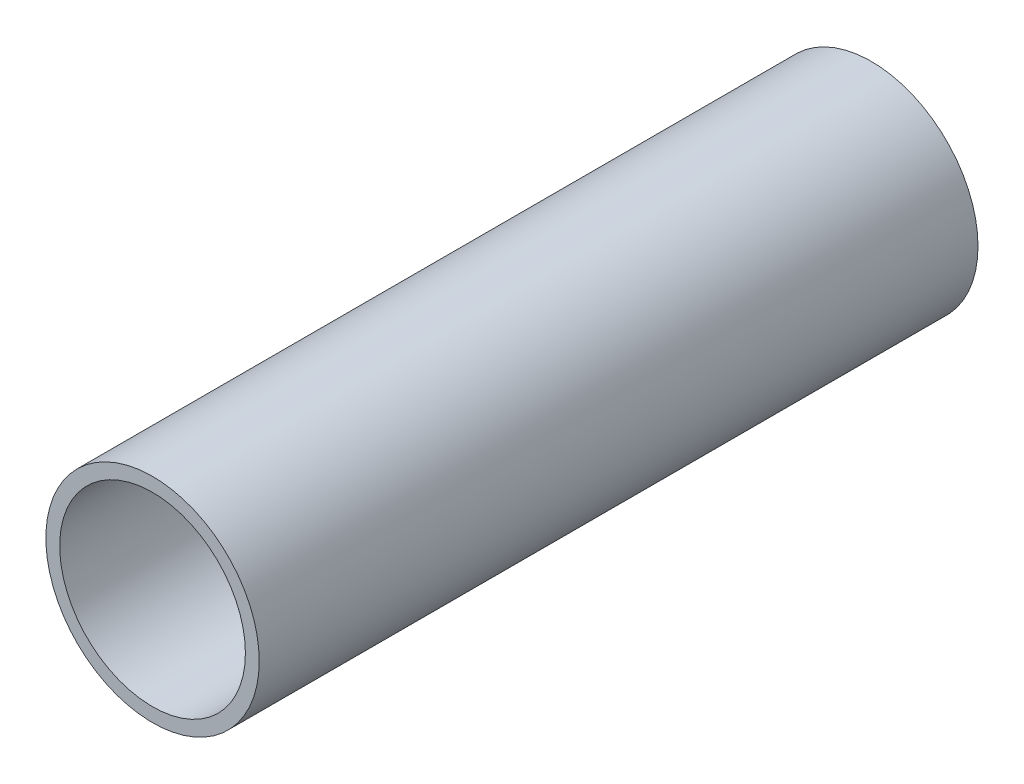
ISO-10303-21;
HEADER;
FILE_DESCRIPTION(('STEP AP214'),'2;1');
FILE_NAME('part.step','',(''),(''),'','','');
FILE_SCHEMA(('AUTOMOTIVE_DESIGN { 1 0 10303 214 1 1 1 1 }'));
ENDSEC;
DATA;
#1=APPLICATION_CONTEXT('core data for automotive mechanical design processes');
#2=APPLICATION_PROTOCOL_DEFINITION('international standard','automotive_design',2000,#1);
#3=PRODUCT_CONTEXT('',#1,'mechanical');
#4=PRODUCT('Part','Part','',(#3));
#5=PRODUCT_RELATED_PRODUCT_CATEGORY('part','',(#4));
#6=PRODUCT_DEFINITION_FORMATION('','',#4);
#7=PRODUCT_DEFINITION_CONTEXT('part definition',#1,'design');
#8=PRODUCT_DEFINITION('design','',#6,#7);
#9=PRODUCT_DEFINITION_SHAPE('','',#8);
#10=(LENGTH_UNIT() NAMED_UNIT(*) SI_UNIT(.MILLI.,.METRE.));
#11=(NAMED_UNIT(*) PLANE_ANGLE_UNIT() SI_UNIT($,.RADIAN.));
#12=(NAMED_UNIT(*) SI_UNIT($,.STERADIAN.) SOLID_ANGLE_UNIT());
#13=UNCERTAINTY_MEASURE_WITH_UNIT(LENGTH_MEASURE(1.E-05),#10,'distance_accuracy_value','');
#14=(GEOMETRIC_REPRESENTATION_CONTEXT(3) GLOBAL_UNCERTAINTY_ASSIGNED_CONTEXT((#13)) GLOBAL_UNIT_ASSIGNED_CONTEXT((#10,
#11,#12)) REPRESENTATION_CONTEXT('',''));
#15=CARTESIAN_POINT('',(0.,0.,0.));
#16=DIRECTION('',(0.,0.,1.));
#17=DIRECTION('',(1.,0.,0.));
#18=AXIS2_PLACEMENT_3D('',#15,#16,#17);
#19=CARTESIAN_POINT('',(0.,0.,203.2));
#20=DIRECTION('',(0.,0.,1.));
#21=DIRECTION('',(1.,0.,0.));
#22=AXIS2_PLACEMENT_3D('',#19,#20,#21);
#23=PLANE('',#22);
#24=CARTESIAN_POINT('',(0.,0.,203.2));
#25=DIRECTION('',(0.,0.,1.));
#26=DIRECTION('',(1.,0.,0.));
#27=AXIS2_PLACEMENT_3D('',#24,#25,#26);
#28=CIRCLE('',#27,30.1625);
#29=CARTESIAN_POINT('',(30.1625,0.,203.2));
#30=VERTEX_POINT('',#29);
#31=EDGE_CURVE('E10',#30,#30,#28,.T.);
#32=ORIENTED_EDGE('',*,*,#31,.T.);
#33=EDGE_LOOP('',(#32));
#34=FACE_BOUND('',#33,.T.);
#35=CARTESIAN_POINT('',(0.,0.,203.2));
#36=DIRECTION('',(0.,0.,1.));
#37=DIRECTION('',(1.,0.,0.));
#38=AXIS2_PLACEMENT_3D('',#35,#36,#37);
#39=CIRCLE('',#38,26.2509);
#40=CARTESIAN_POINT('',(26.2509,0.,203.2));
#41=VERTEX_POINT('',#40);
#42=EDGE_CURVE('E54',#41,#41,#39,.T.);
#43=ORIENTED_EDGE('',*,*,#42,.F.);
#44=EDGE_LOOP('',(#43));
#45=FACE_BOUND('',#44,.T.);
#46=ADVANCED_FACE('F41',(#34,#45),#23,.T.);
#47=CARTESIAN_POINT('',(0.,0.,0.));
#48=DIRECTION('',(0.,0.,1.));
#49=DIRECTION('',(1.,0.,0.));
#50=AXIS2_PLACEMENT_3D('',#47,#48,#49);
#51=PLANE('',#50);
#52=CARTESIAN_POINT('',(0.,0.,0.));
#53=DIRECTION('',(0.,0.,1.));
#54=DIRECTION('',(1.,0.,0.));
#55=AXIS2_PLACEMENT_3D('',#52,#53,#54);
#56=CIRCLE('',#55,30.1625);
#57=CARTESIAN_POINT('',(30.1625,0.,0.));
#58=VERTEX_POINT('',#57);
#59=EDGE_CURVE('E45',#58,#58,#56,.T.);
#60=ORIENTED_EDGE('',*,*,#59,.F.);
#61=EDGE_LOOP('',(#60));
#62=FACE_BOUND('',#61,.T.);
#63=CARTESIAN_POINT('',(0.,0.,0.));
#64=DIRECTION('',(0.,0.,1.));
#65=DIRECTION('',(1.,0.,0.));
#66=AXIS2_PLACEMENT_3D('',#63,#64,#65);
#67=CIRCLE('',#66,26.2509);
#68=CARTESIAN_POINT('',(26.2509,0.,0.));
#69=VERTEX_POINT('',#68);
#70=EDGE_CURVE('E56',#69,#69,#67,.T.);
#71=ORIENTED_EDGE('',*,*,#70,.T.);
#72=EDGE_LOOP('',(#71));
#73=FACE_BOUND('',#72,.T.);
#74=ADVANCED_FACE('F68',(#62,#73),#51,.F.);
#75=CARTESIAN_POINT('',(0.,0.,203.2));
#76=DIRECTION('',(0.,0.,-1.));
#77=DIRECTION('',(-1.,0.,0.));
#78=AXIS2_PLACEMENT_3D('',#75,#76,#77);
#79=CYLINDRICAL_SURFACE('',#78,30.1625);
#80=ORIENTED_EDGE('',*,*,#31,.F.);
#81=EDGE_LOOP('',(#80));
#82=FACE_BOUND('',#81,.T.);
#83=ORIENTED_EDGE('',*,*,#59,.T.);
#84=EDGE_LOOP('',(#83));
#85=FACE_BOUND('',#84,.T.);
#86=ADVANCED_FACE('F43',(#82,#85),#79,.T.);
#87=CARTESIAN_POINT('',(0.,0.,203.2));
#88=DIRECTION('',(0.,0.,-1.));
#89=DIRECTION('',(-1.,0.,0.));
#90=AXIS2_PLACEMENT_3D('',#87,#88,#89);
#91=CYLINDRICAL_SURFACE('',#90,26.2509);
#92=ORIENTED_EDGE('',*,*,#42,.T.);
#93=EDGE_LOOP('',(#92));
#94=FACE_BOUND('',#93,.T.);
#95=ORIENTED_EDGE('',*,*,#70,.F.);
#96=EDGE_LOOP('',(#95));
#97=FACE_BOUND('',#96,.T.);
#98=ADVANCED_FACE('F64',(#94,#97),#91,.F.);
#99=CLOSED_SHELL('',(#46,#74,#86,#98));
#100=MANIFOLD_SOLID_BREP('B2',#99);
#101=ADVANCED_BREP_SHAPE_REPRESENTATION('',(#18,#100),#14);
#102=SHAPE_DEFINITION_REPRESENTATION(#9,#101);
ENDSEC;
END-ISO-10303-21;
